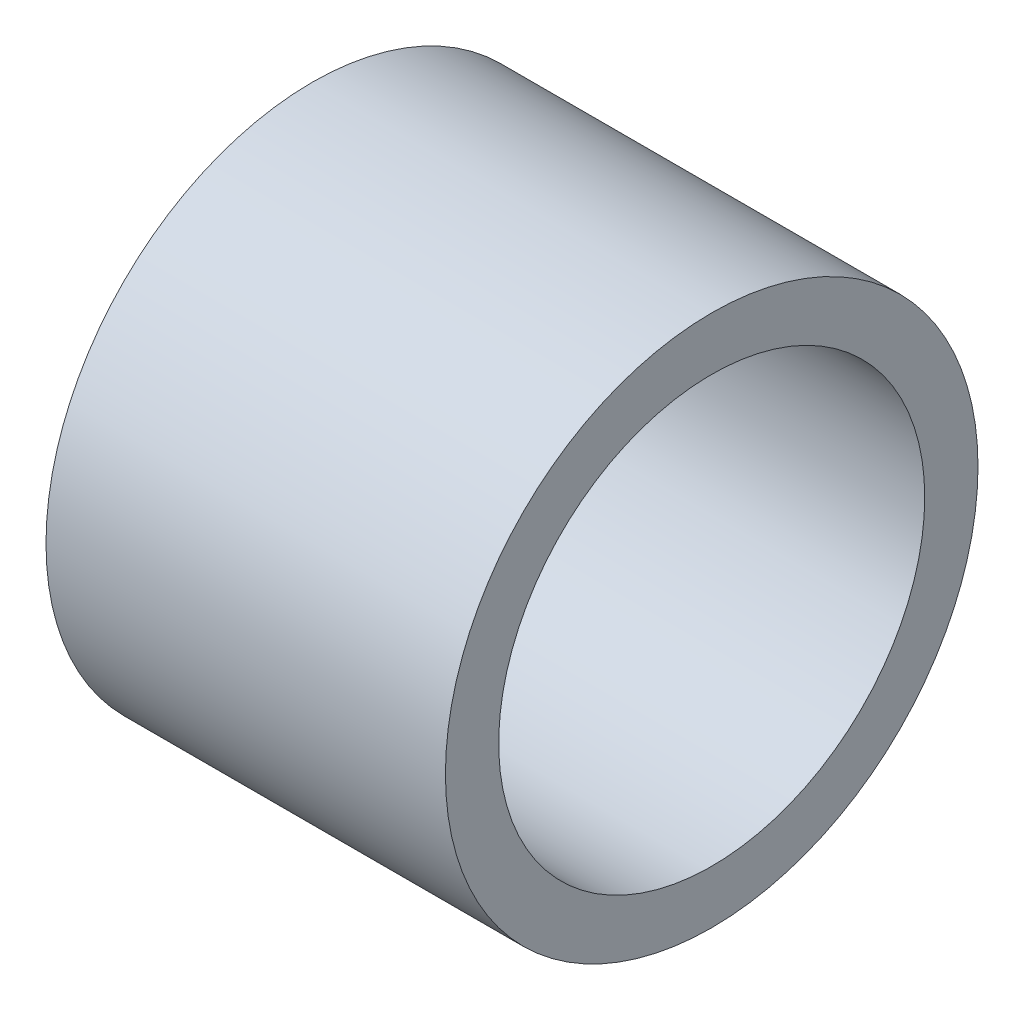
ISO-10303-21;
HEADER;
FILE_DESCRIPTION(('STEP AP214'),'2;1');
FILE_NAME('part.step','',(''),(''),'','','');
FILE_SCHEMA(('AUTOMOTIVE_DESIGN { 1 0 10303 214 1 1 1 1 }'));
ENDSEC;
DATA;
#1=APPLICATION_CONTEXT('core data for automotive mechanical design processes');
#2=APPLICATION_PROTOCOL_DEFINITION('international standard','automotive_design',2000,#1);
#3=PRODUCT_CONTEXT('',#1,'mechanical');
#4=PRODUCT('Part','Part','',(#3));
#5=PRODUCT_RELATED_PRODUCT_CATEGORY('part','',(#4));
#6=PRODUCT_DEFINITION_FORMATION('','',#4);
#7=PRODUCT_DEFINITION_CONTEXT('part definition',#1,'design');
#8=PRODUCT_DEFINITION('design','',#6,#7);
#9=PRODUCT_DEFINITION_SHAPE('','',#8);
#10=(LENGTH_UNIT() NAMED_UNIT(*) SI_UNIT(.MILLI.,.METRE.));
#11=(NAMED_UNIT(*) PLANE_ANGLE_UNIT() SI_UNIT($,.RADIAN.));
#12=(NAMED_UNIT(*) SI_UNIT($,.STERADIAN.) SOLID_ANGLE_UNIT());
#13=UNCERTAINTY_MEASURE_WITH_UNIT(LENGTH_MEASURE(1.E-05),#10,'distance_accuracy_value','');
#14=(GEOMETRIC_REPRESENTATION_CONTEXT(3) GLOBAL_UNCERTAINTY_ASSIGNED_CONTEXT((#13)) GLOBAL_UNIT_ASSIGNED_CONTEXT((#10,
#11,#12)) REPRESENTATION_CONTEXT('',''));
#15=CARTESIAN_POINT('',(0.,0.,0.));
#16=DIRECTION('',(0.,0.,1.));
#17=DIRECTION('',(1.,0.,0.));
#18=AXIS2_PLACEMENT_3D('',#15,#16,#17);
#19=CARTESIAN_POINT('',(200.831144743785,98.6716742459517,148.819588846238));
#20=DIRECTION('',(1.,0.,0.));
#21=DIRECTION('',(0.,0.,-1.));
#22=AXIS2_PLACEMENT_3D('',#19,#20,#21);
#23=PLANE('',#22);
#24=CARTESIAN_POINT('',(200.831144743785,98.6716742459517,148.819588846238));
#25=DIRECTION('',(1.,0.,0.));
#26=DIRECTION('',(0.,1.,0.));
#27=AXIS2_PLACEMENT_3D('',#24,#25,#26);
#28=CIRCLE('',#27,10.);
#29=CARTESIAN_POINT('',(200.831144743785,108.671674245952,148.819588846238));
#30=VERTEX_POINT('',#29);
#31=EDGE_CURVE('E10',#30,#30,#28,.T.);
#32=ORIENTED_EDGE('',*,*,#31,.T.);
#33=EDGE_LOOP('',(#32));
#34=FACE_BOUND('',#33,.T.);
#35=CARTESIAN_POINT('',(200.831144743785,98.6716742459517,148.819588846238));
#36=DIRECTION('',(1.,0.,0.));
#37=DIRECTION('',(0.,0.,-1.));
#38=AXIS2_PLACEMENT_3D('',#35,#36,#37);
#39=CIRCLE('',#38,8.);
#40=CARTESIAN_POINT('',(200.831144743785,98.6716742459516,140.819588846238));
#41=VERTEX_POINT('',#40);
#42=EDGE_CURVE('E43',#41,#41,#39,.T.);
#43=ORIENTED_EDGE('',*,*,#42,.F.);
#44=EDGE_LOOP('',(#43));
#45=FACE_BOUND('',#44,.T.);
#46=ADVANCED_FACE('F32',(#34,#45),#23,.T.);
#47=CARTESIAN_POINT('',(185.831144743785,98.6716742459517,148.819588846238));
#48=DIRECTION('',(1.,0.,0.));
#49=DIRECTION('',(0.,0.,-1.));
#50=AXIS2_PLACEMENT_3D('',#47,#48,#49);
#51=PLANE('',#50);
#52=CARTESIAN_POINT('',(185.831144743785,98.6716742459517,148.819588846238));
#53=DIRECTION('',(1.,0.,0.));
#54=DIRECTION('',(0.,1.,0.));
#55=AXIS2_PLACEMENT_3D('',#52,#53,#54);
#56=CIRCLE('',#55,10.);
#57=CARTESIAN_POINT('',(185.831144743785,108.671674245952,148.819588846238));
#58=VERTEX_POINT('',#57);
#59=EDGE_CURVE('E36',#58,#58,#56,.T.);
#60=ORIENTED_EDGE('',*,*,#59,.F.);
#61=EDGE_LOOP('',(#60));
#62=FACE_BOUND('',#61,.T.);
#63=CARTESIAN_POINT('',(185.831144743785,98.6716742459517,148.819588846238));
#64=DIRECTION('',(1.,0.,0.));
#65=DIRECTION('',(0.,0.,-1.));
#66=AXIS2_PLACEMENT_3D('',#63,#64,#65);
#67=CIRCLE('',#66,8.);
#68=CARTESIAN_POINT('',(185.831144743785,98.6716742459516,140.819588846238));
#69=VERTEX_POINT('',#68);
#70=EDGE_CURVE('E45',#69,#69,#67,.T.);
#71=ORIENTED_EDGE('',*,*,#70,.T.);
#72=EDGE_LOOP('',(#71));
#73=FACE_BOUND('',#72,.T.);
#74=ADVANCED_FACE('F55',(#62,#73),#51,.F.);
#75=CARTESIAN_POINT('',(200.831144743785,98.6716742459517,148.819588846238));
#76=DIRECTION('',(-1.,0.,0.));
#77=DIRECTION('',(0.,0.,1.));
#78=AXIS2_PLACEMENT_3D('',#75,#76,#77);
#79=CYLINDRICAL_SURFACE('',#78,10.);
#80=ORIENTED_EDGE('',*,*,#31,.F.);
#81=EDGE_LOOP('',(#80));
#82=FACE_BOUND('',#81,.T.);
#83=ORIENTED_EDGE('',*,*,#59,.T.);
#84=EDGE_LOOP('',(#83));
#85=FACE_BOUND('',#84,.T.);
#86=ADVANCED_FACE('F34',(#82,#85),#79,.T.);
#87=CARTESIAN_POINT('',(200.831144743785,98.6716742459517,148.819588846238));
#88=DIRECTION('',(-1.,0.,0.));
#89=DIRECTION('',(0.,0.,1.));
#90=AXIS2_PLACEMENT_3D('',#87,#88,#89);
#91=CYLINDRICAL_SURFACE('',#90,8.);
#92=ORIENTED_EDGE('',*,*,#42,.T.);
#93=EDGE_LOOP('',(#92));
#94=FACE_BOUND('',#93,.T.);
#95=ORIENTED_EDGE('',*,*,#70,.F.);
#96=EDGE_LOOP('',(#95));
#97=FACE_BOUND('',#96,.T.);
#98=ADVANCED_FACE('F51',(#94,#97),#91,.F.);
#99=CLOSED_SHELL('',(#46,#74,#86,#98));
#100=MANIFOLD_SOLID_BREP('B2',#99);
#101=ADVANCED_BREP_SHAPE_REPRESENTATION('',(#18,#100),#14);
#102=SHAPE_DEFINITION_REPRESENTATION(#9,#101);
ENDSEC;
END-ISO-10303-21;
